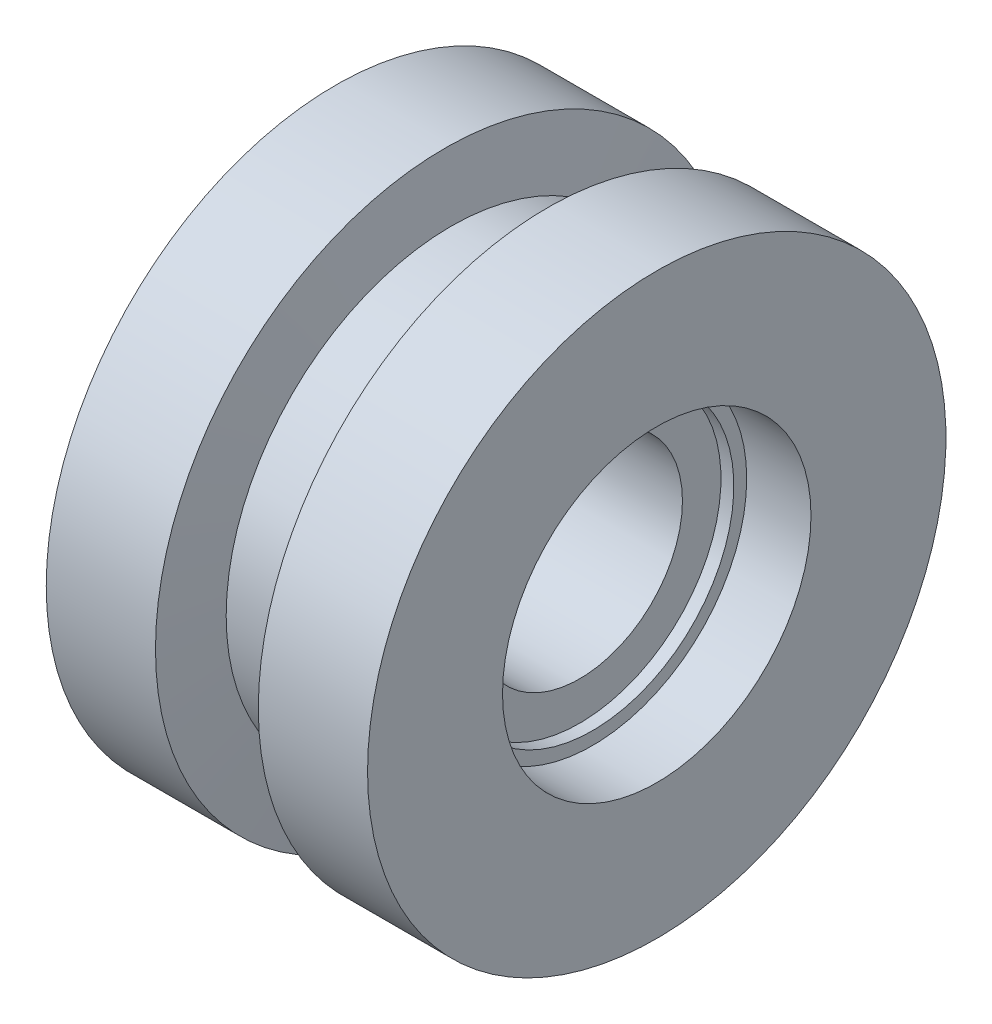
ISO-10303-21;
HEADER;
FILE_DESCRIPTION(('STEP AP214'),'2;1');
FILE_NAME('part.step','',(''),(''),'','','');
FILE_SCHEMA(('AUTOMOTIVE_DESIGN { 1 0 10303 214 1 1 1 1 }'));
ENDSEC;
DATA;
#1=APPLICATION_CONTEXT('core data for automotive mechanical design processes');
#2=APPLICATION_PROTOCOL_DEFINITION('international standard','automotive_design',2000,#1);
#3=PRODUCT_CONTEXT('',#1,'mechanical');
#4=PRODUCT('Part','Part','',(#3));
#5=PRODUCT_RELATED_PRODUCT_CATEGORY('part','',(#4));
#6=PRODUCT_DEFINITION_FORMATION('','',#4);
#7=PRODUCT_DEFINITION_CONTEXT('part definition',#1,'design');
#8=PRODUCT_DEFINITION('design','',#6,#7);
#9=PRODUCT_DEFINITION_SHAPE('','',#8);
#10=(LENGTH_UNIT() NAMED_UNIT(*) SI_UNIT(.MILLI.,.METRE.));
#11=(NAMED_UNIT(*) PLANE_ANGLE_UNIT() SI_UNIT($,.RADIAN.));
#12=(NAMED_UNIT(*) SI_UNIT($,.STERADIAN.) SOLID_ANGLE_UNIT());
#13=UNCERTAINTY_MEASURE_WITH_UNIT(LENGTH_MEASURE(1.E-05),#10,'distance_accuracy_value','');
#14=(GEOMETRIC_REPRESENTATION_CONTEXT(3) GLOBAL_UNCERTAINTY_ASSIGNED_CONTEXT((#13)) GLOBAL_UNIT_ASSIGNED_CONTEXT((#10,
#11,#12)) REPRESENTATION_CONTEXT('',''));
#15=CARTESIAN_POINT('',(0.,0.,0.));
#16=DIRECTION('',(0.,0.,1.));
#17=DIRECTION('',(1.,0.,0.));
#18=AXIS2_PLACEMENT_3D('',#15,#16,#17);
#19=CARTESIAN_POINT('',(0.,0.,0.));
#20=DIRECTION('',(-1.,0.,0.));
#21=DIRECTION('',(0.,0.,1.));
#22=AXIS2_PLACEMENT_3D('',#19,#20,#21);
#23=CYLINDRICAL_SURFACE('',#22,22.5);
#24=CARTESIAN_POINT('',(0.,0.,0.));
#25=DIRECTION('',(-1.,0.,0.));
#26=DIRECTION('',(0.,0.,1.));
#27=AXIS2_PLACEMENT_3D('',#24,#25,#26);
#28=CIRCLE('',#27,22.5);
#29=CARTESIAN_POINT('',(0.,0.,22.5));
#30=VERTEX_POINT('',#29);
#31=EDGE_CURVE('E74',#30,#30,#28,.T.);
#32=ORIENTED_EDGE('',*,*,#31,.F.);
#33=EDGE_LOOP('',(#32));
#34=FACE_BOUND('',#33,.T.);
#35=CARTESIAN_POINT('',(8.49999999999999,0.,0.));
#36=DIRECTION('',(-1.,0.,0.));
#37=DIRECTION('',(0.,0.,1.));
#38=AXIS2_PLACEMENT_3D('',#35,#36,#37);
#39=CIRCLE('',#38,22.5);
#40=CARTESIAN_POINT('',(8.49999999999999,0.,22.5));
#41=VERTEX_POINT('',#40);
#42=EDGE_CURVE('E77',#41,#41,#39,.T.);
#43=ORIENTED_EDGE('',*,*,#42,.T.);
#44=EDGE_LOOP('',(#43));
#45=FACE_BOUND('',#44,.T.);
#46=ADVANCED_FACE('F33',(#34,#45),#23,.T.);
#47=CARTESIAN_POINT('',(25.,0.,0.));
#48=DIRECTION('',(-1.,0.,0.));
#49=DIRECTION('',(0.,0.,1.));
#50=AXIS2_PLACEMENT_3D('',#47,#48,#49);
#51=CIRCLE('',#50,22.5);
#52=CARTESIAN_POINT('',(25.,0.,22.5));
#53=VERTEX_POINT('',#52);
#54=EDGE_CURVE('E71',#53,#53,#51,.T.);
#55=ORIENTED_EDGE('',*,*,#54,.T.);
#56=EDGE_LOOP('',(#55));
#57=FACE_BOUND('',#56,.T.);
#58=CARTESIAN_POINT('',(16.5,0.,0.));
#59=DIRECTION('',(-1.,0.,0.));
#60=DIRECTION('',(0.,0.,1.));
#61=AXIS2_PLACEMENT_3D('',#58,#59,#60);
#62=CIRCLE('',#61,22.5);
#63=CARTESIAN_POINT('',(16.5,0.,22.5));
#64=VERTEX_POINT('',#63);
#65=EDGE_CURVE('E86',#64,#64,#62,.T.);
#66=ORIENTED_EDGE('',*,*,#65,.F.);
#67=EDGE_LOOP('',(#66));
#68=FACE_BOUND('',#67,.T.);
#69=ADVANCED_FACE('F93',(#57,#68),#23,.T.);
#70=CARTESIAN_POINT('',(0.,0.,-22.5));
#71=DIRECTION('',(1.,0.,0.));
#72=DIRECTION('',(0.,0.,-1.));
#73=AXIS2_PLACEMENT_3D('',#70,#71,#72);
#74=PLANE('',#73);
#75=CARTESIAN_POINT('',(0.,0.,0.));
#76=DIRECTION('',(-1.,0.,0.));
#77=DIRECTION('',(0.,0.,1.));
#78=AXIS2_PLACEMENT_3D('',#75,#76,#77);
#79=CIRCLE('',#78,12.);
#80=CARTESIAN_POINT('',(0.,0.,12.));
#81=VERTEX_POINT('',#80);
#82=EDGE_CURVE('E10',#81,#81,#79,.T.);
#83=ORIENTED_EDGE('',*,*,#82,.F.);
#84=EDGE_LOOP('',(#83));
#85=FACE_BOUND('',#84,.T.);
#86=ORIENTED_EDGE('',*,*,#31,.T.);
#87=EDGE_LOOP('',(#86));
#88=FACE_BOUND('',#87,.T.);
#89=ADVANCED_FACE('F35',(#85,#88),#74,.F.);
#90=CARTESIAN_POINT('',(0.,0.,0.));
#91=DIRECTION('',(-1.,0.,0.));
#92=DIRECTION('',(0.,0.,1.));
#93=AXIS2_PLACEMENT_3D('',#90,#91,#92);
#94=CYLINDRICAL_SURFACE('',#93,12.);
#95=CARTESIAN_POINT('',(5.,0.,0.));
#96=DIRECTION('',(-1.,0.,0.));
#97=DIRECTION('',(0.,0.,1.));
#98=AXIS2_PLACEMENT_3D('',#95,#96,#97);
#99=CIRCLE('',#98,12.);
#100=CARTESIAN_POINT('',(5.,0.,12.));
#101=VERTEX_POINT('',#100);
#102=EDGE_CURVE('E40',#101,#101,#99,.T.);
#103=ORIENTED_EDGE('',*,*,#102,.F.);
#104=EDGE_LOOP('',(#103));
#105=FACE_BOUND('',#104,.T.);
#106=ORIENTED_EDGE('',*,*,#82,.T.);
#107=EDGE_LOOP('',(#106));
#108=FACE_BOUND('',#107,.T.);
#109=ADVANCED_FACE('F101',(#105,#108),#94,.F.);
#110=CARTESIAN_POINT('',(5.,0.,-12.));
#111=DIRECTION('',(1.,0.,0.));
#112=DIRECTION('',(0.,0.,-1.));
#113=AXIS2_PLACEMENT_3D('',#110,#111,#112);
#114=PLANE('',#113);
#115=CARTESIAN_POINT('',(5.,0.,0.));
#116=DIRECTION('',(-1.,0.,0.));
#117=DIRECTION('',(0.,0.,1.));
#118=AXIS2_PLACEMENT_3D('',#115,#116,#117);
#119=CIRCLE('',#118,10.9969916425891);
#120=CARTESIAN_POINT('',(5.,0.,10.9969916425891));
#121=VERTEX_POINT('',#120);
#122=EDGE_CURVE('E44',#121,#121,#119,.T.);
#123=ORIENTED_EDGE('',*,*,#122,.F.);
#124=EDGE_LOOP('',(#123));
#125=FACE_BOUND('',#124,.T.);
#126=ORIENTED_EDGE('',*,*,#102,.T.);
#127=EDGE_LOOP('',(#126));
#128=FACE_BOUND('',#127,.T.);
#129=ADVANCED_FACE('F139',(#125,#128),#114,.F.);
#130=CARTESIAN_POINT('',(0.,0.,0.));
#131=DIRECTION('',(-1.,0.,0.));
#132=DIRECTION('',(0.,0.,1.));
#133=AXIS2_PLACEMENT_3D('',#130,#131,#132);
#134=CYLINDRICAL_SURFACE('',#133,10.9969916425891);
#135=CARTESIAN_POINT('',(6.,0.,0.));
#136=DIRECTION('',(-1.,0.,0.));
#137=DIRECTION('',(0.,0.,1.));
#138=AXIS2_PLACEMENT_3D('',#135,#136,#137);
#139=CIRCLE('',#138,10.9969916425891);
#140=CARTESIAN_POINT('',(6.,0.,10.9969916425891));
#141=VERTEX_POINT('',#140);
#142=EDGE_CURVE('E48',#141,#141,#139,.T.);
#143=ORIENTED_EDGE('',*,*,#142,.F.);
#144=EDGE_LOOP('',(#143));
#145=FACE_BOUND('',#144,.T.);
#146=ORIENTED_EDGE('',*,*,#122,.T.);
#147=EDGE_LOOP('',(#146));
#148=FACE_BOUND('',#147,.T.);
#149=ADVANCED_FACE('F135',(#145,#148),#134,.F.);
#150=CARTESIAN_POINT('',(6.,0.,-10.9969916425891));
#151=DIRECTION('',(1.,0.,0.));
#152=DIRECTION('',(0.,0.,-1.));
#153=AXIS2_PLACEMENT_3D('',#150,#151,#152);
#154=PLANE('',#153);
#155=CARTESIAN_POINT('',(6.,0.,0.));
#156=DIRECTION('',(-1.,0.,0.));
#157=DIRECTION('',(0.,0.,1.));
#158=AXIS2_PLACEMENT_3D('',#155,#156,#157);
#159=CIRCLE('',#158,8.);
#160=CARTESIAN_POINT('',(6.,0.,8.));
#161=VERTEX_POINT('',#160);
#162=EDGE_CURVE('E53',#161,#161,#159,.T.);
#163=ORIENTED_EDGE('',*,*,#162,.F.);
#164=EDGE_LOOP('',(#163));
#165=FACE_BOUND('',#164,.T.);
#166=ORIENTED_EDGE('',*,*,#142,.T.);
#167=EDGE_LOOP('',(#166));
#168=FACE_BOUND('',#167,.T.);
#169=ADVANCED_FACE('F131',(#165,#168),#154,.F.);
#170=CARTESIAN_POINT('',(0.,0.,0.));
#171=DIRECTION('',(-1.,0.,0.));
#172=DIRECTION('',(0.,0.,1.));
#173=AXIS2_PLACEMENT_3D('',#170,#171,#172);
#174=CYLINDRICAL_SURFACE('',#173,8.);
#175=CARTESIAN_POINT('',(19.,0.,0.));
#176=DIRECTION('',(-1.,0.,0.));
#177=DIRECTION('',(0.,0.,1.));
#178=AXIS2_PLACEMENT_3D('',#175,#176,#177);
#179=CIRCLE('',#178,8.);
#180=CARTESIAN_POINT('',(19.,0.,8.));
#181=VERTEX_POINT('',#180);
#182=EDGE_CURVE('E56',#181,#181,#179,.T.);
#183=ORIENTED_EDGE('',*,*,#182,.F.);
#184=EDGE_LOOP('',(#183));
#185=FACE_BOUND('',#184,.T.);
#186=ORIENTED_EDGE('',*,*,#162,.T.);
#187=EDGE_LOOP('',(#186));
#188=FACE_BOUND('',#187,.T.);
#189=ADVANCED_FACE('F127',(#185,#188),#174,.F.);
#190=CARTESIAN_POINT('',(19.,0.,-10.9969916425891));
#191=DIRECTION('',(-1.,0.,0.));
#192=DIRECTION('',(0.,0.,1.));
#193=AXIS2_PLACEMENT_3D('',#190,#191,#192);
#194=PLANE('',#193);
#195=CARTESIAN_POINT('',(19.,0.,0.));
#196=DIRECTION('',(-1.,0.,0.));
#197=DIRECTION('',(0.,0.,1.));
#198=AXIS2_PLACEMENT_3D('',#195,#196,#197);
#199=CIRCLE('',#198,10.9969916425891);
#200=CARTESIAN_POINT('',(19.,0.,10.9969916425891));
#201=VERTEX_POINT('',#200);
#202=EDGE_CURVE('E59',#201,#201,#199,.T.);
#203=ORIENTED_EDGE('',*,*,#202,.F.);
#204=EDGE_LOOP('',(#203));
#205=FACE_BOUND('',#204,.T.);
#206=ORIENTED_EDGE('',*,*,#182,.T.);
#207=EDGE_LOOP('',(#206));
#208=FACE_BOUND('',#207,.T.);
#209=ADVANCED_FACE('F123',(#205,#208),#194,.F.);
#210=CARTESIAN_POINT('',(0.,0.,0.));
#211=DIRECTION('',(-1.,0.,0.));
#212=DIRECTION('',(0.,0.,1.));
#213=AXIS2_PLACEMENT_3D('',#210,#211,#212);
#214=CYLINDRICAL_SURFACE('',#213,10.9969916425891);
#215=CARTESIAN_POINT('',(20.,0.,0.));
#216=DIRECTION('',(-1.,0.,0.));
#217=DIRECTION('',(0.,0.,1.));
#218=AXIS2_PLACEMENT_3D('',#215,#216,#217);
#219=CIRCLE('',#218,10.9969916425891);
#220=CARTESIAN_POINT('',(20.,0.,10.9969916425891));
#221=VERTEX_POINT('',#220);
#222=EDGE_CURVE('E62',#221,#221,#219,.T.);
#223=ORIENTED_EDGE('',*,*,#222,.F.);
#224=EDGE_LOOP('',(#223));
#225=FACE_BOUND('',#224,.T.);
#226=ORIENTED_EDGE('',*,*,#202,.T.);
#227=EDGE_LOOP('',(#226));
#228=FACE_BOUND('',#227,.T.);
#229=ADVANCED_FACE('F119',(#225,#228),#214,.F.);
#230=CARTESIAN_POINT('',(20.,0.,-10.9969916425891));
#231=DIRECTION('',(-1.,0.,0.));
#232=DIRECTION('',(0.,0.,1.));
#233=AXIS2_PLACEMENT_3D('',#230,#231,#232);
#234=PLANE('',#233);
#235=CARTESIAN_POINT('',(20.,0.,0.));
#236=DIRECTION('',(-1.,0.,0.));
#237=DIRECTION('',(0.,0.,1.));
#238=AXIS2_PLACEMENT_3D('',#235,#236,#237);
#239=CIRCLE('',#238,12.);
#240=CARTESIAN_POINT('',(20.,0.,12.));
#241=VERTEX_POINT('',#240);
#242=EDGE_CURVE('E65',#241,#241,#239,.T.);
#243=ORIENTED_EDGE('',*,*,#242,.F.);
#244=EDGE_LOOP('',(#243));
#245=FACE_BOUND('',#244,.T.);
#246=ORIENTED_EDGE('',*,*,#222,.T.);
#247=EDGE_LOOP('',(#246));
#248=FACE_BOUND('',#247,.T.);
#249=ADVANCED_FACE('F115',(#245,#248),#234,.F.);
#250=CARTESIAN_POINT('',(0.,0.,0.));
#251=DIRECTION('',(-1.,0.,0.));
#252=DIRECTION('',(0.,0.,1.));
#253=AXIS2_PLACEMENT_3D('',#250,#251,#252);
#254=CYLINDRICAL_SURFACE('',#253,12.);
#255=CARTESIAN_POINT('',(25.,0.,0.));
#256=DIRECTION('',(-1.,0.,0.));
#257=DIRECTION('',(0.,0.,1.));
#258=AXIS2_PLACEMENT_3D('',#255,#256,#257);
#259=CIRCLE('',#258,12.);
#260=CARTESIAN_POINT('',(25.,0.,12.));
#261=VERTEX_POINT('',#260);
#262=EDGE_CURVE('E68',#261,#261,#259,.T.);
#263=ORIENTED_EDGE('',*,*,#262,.F.);
#264=EDGE_LOOP('',(#263));
#265=FACE_BOUND('',#264,.T.);
#266=ORIENTED_EDGE('',*,*,#242,.T.);
#267=EDGE_LOOP('',(#266));
#268=FACE_BOUND('',#267,.T.);
#269=ADVANCED_FACE('F111',(#265,#268),#254,.F.);
#270=CARTESIAN_POINT('',(25.,0.,-22.5));
#271=DIRECTION('',(-1.,0.,0.));
#272=DIRECTION('',(0.,0.,1.));
#273=AXIS2_PLACEMENT_3D('',#270,#271,#272);
#274=PLANE('',#273);
#275=ORIENTED_EDGE('',*,*,#54,.F.);
#276=EDGE_LOOP('',(#275));
#277=FACE_BOUND('',#276,.T.);
#278=ORIENTED_EDGE('',*,*,#262,.T.);
#279=EDGE_LOOP('',(#278));
#280=FACE_BOUND('',#279,.T.);
#281=ADVANCED_FACE('F108',(#277,#280),#274,.F.);
#282=CARTESIAN_POINT('',(8.49999999999999,0.,0.));
#283=DIRECTION('',(-1.,0.,0.));
#284=DIRECTION('',(0.,0.,1.));
#285=AXIS2_PLACEMENT_3D('',#282,#283,#284);
#286=CONICAL_SURFACE('',#285,22.5,1.47112767430373);
#287=CARTESIAN_POINT('',(8.99999999999999,0.,0.));
#288=DIRECTION('',(-1.,0.,0.));
#289=DIRECTION('',(0.,0.,1.));
#290=AXIS2_PLACEMENT_3D('',#287,#288,#289);
#291=CIRCLE('',#290,17.5);
#292=CARTESIAN_POINT('',(8.99999999999999,0.,17.5));
#293=VERTEX_POINT('',#292);
#294=EDGE_CURVE('E80',#293,#293,#291,.T.);
#295=ORIENTED_EDGE('',*,*,#294,.T.);
#296=EDGE_LOOP('',(#295));
#297=FACE_BOUND('',#296,.T.);
#298=ORIENTED_EDGE('',*,*,#42,.F.);
#299=EDGE_LOOP('',(#298));
#300=FACE_BOUND('',#299,.T.);
#301=ADVANCED_FACE('F106',(#297,#300),#286,.T.);
#302=CARTESIAN_POINT('',(0.,0.,0.));
#303=DIRECTION('',(-1.,0.,0.));
#304=DIRECTION('',(0.,0.,1.));
#305=AXIS2_PLACEMENT_3D('',#302,#303,#304);
#306=CYLINDRICAL_SURFACE('',#305,17.5);
#307=CARTESIAN_POINT('',(16.,0.,0.));
#308=DIRECTION('',(-1.,0.,0.));
#309=DIRECTION('',(0.,0.,1.));
#310=AXIS2_PLACEMENT_3D('',#307,#308,#309);
#311=CIRCLE('',#310,17.5);
#312=CARTESIAN_POINT('',(16.,0.,17.5));
#313=VERTEX_POINT('',#312);
#314=EDGE_CURVE('E83',#313,#313,#311,.T.);
#315=ORIENTED_EDGE('',*,*,#314,.T.);
#316=EDGE_LOOP('',(#315));
#317=FACE_BOUND('',#316,.T.);
#318=ORIENTED_EDGE('',*,*,#294,.F.);
#319=EDGE_LOOP('',(#318));
#320=FACE_BOUND('',#319,.T.);
#321=ADVANCED_FACE('F192',(#317,#320),#306,.T.);
#322=CARTESIAN_POINT('',(16.,0.,0.));
#323=DIRECTION('',(1.,0.,0.));
#324=DIRECTION('',(0.,0.,-1.));
#325=AXIS2_PLACEMENT_3D('',#322,#323,#324);
#326=CONICAL_SURFACE('',#325,17.5,1.47112767430373);
#327=ORIENTED_EDGE('',*,*,#65,.T.);
#328=EDGE_LOOP('',(#327));
#329=FACE_BOUND('',#328,.T.);
#330=ORIENTED_EDGE('',*,*,#314,.F.);
#331=EDGE_LOOP('',(#330));
#332=FACE_BOUND('',#331,.T.);
#333=ADVANCED_FACE('F90',(#329,#332),#326,.T.);
#334=CLOSED_SHELL('',(#46,#69,#89,#109,#129,#149,#169,#189,#209,#229,#249,#269,#281,#301,#321,#333));
#335=MANIFOLD_SOLID_BREP('B2',#334);
#336=ADVANCED_BREP_SHAPE_REPRESENTATION('',(#18,#335),#14);
#337=SHAPE_DEFINITION_REPRESENTATION(#9,#336);
ENDSEC;
END-ISO-10303-21;
